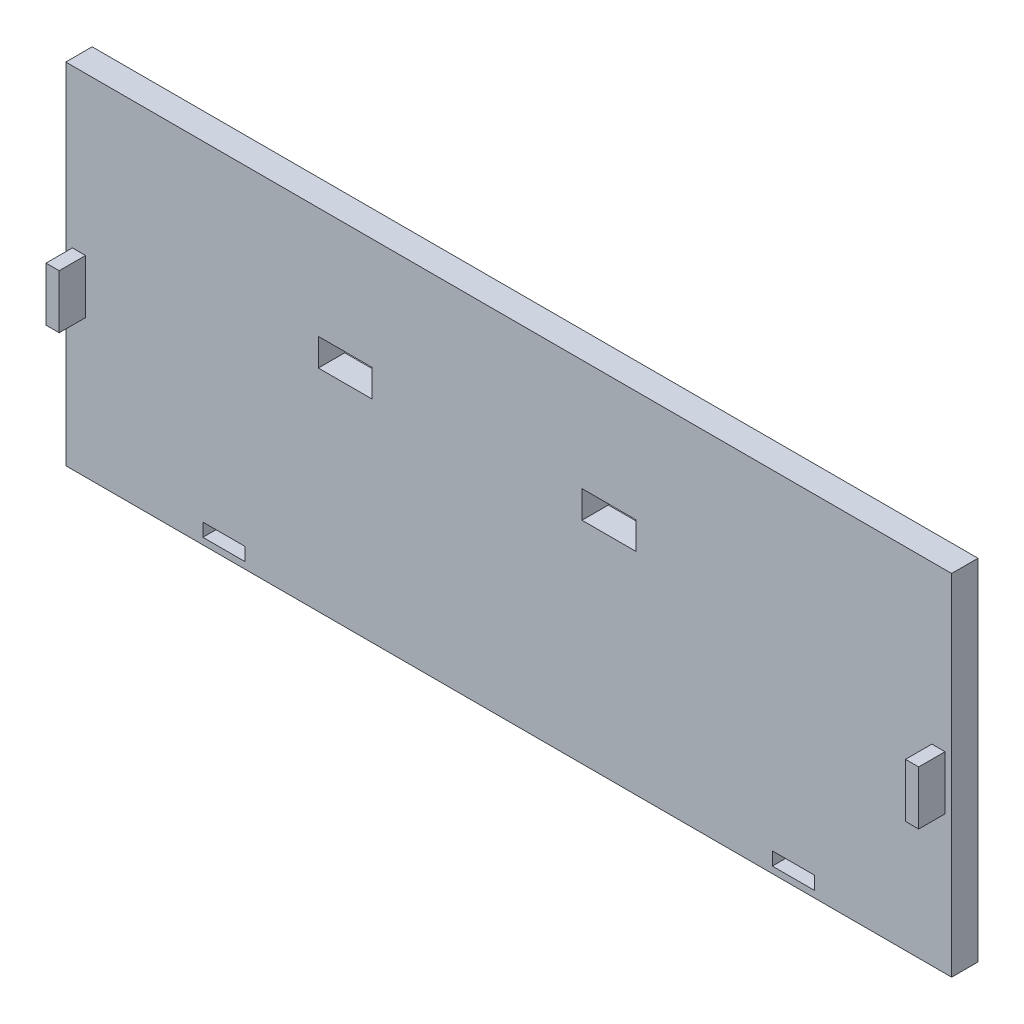
ISO-10303-21;
HEADER;
FILE_DESCRIPTION(('STEP AP214'),'2;1');
FILE_NAME('part.step','',(''),(''),'','','');
FILE_SCHEMA(('AUTOMOTIVE_DESIGN { 1 0 10303 214 1 1 1 1 }'));
ENDSEC;
DATA;
#1=APPLICATION_CONTEXT('core data for automotive mechanical design processes');
#2=APPLICATION_PROTOCOL_DEFINITION('international standard','automotive_design',2000,#1);
#3=PRODUCT_CONTEXT('',#1,'mechanical');
#4=PRODUCT('Part','Part','',(#3));
#5=PRODUCT_RELATED_PRODUCT_CATEGORY('part','',(#4));
#6=PRODUCT_DEFINITION_FORMATION('','',#4);
#7=PRODUCT_DEFINITION_CONTEXT('part definition',#1,'design');
#8=PRODUCT_DEFINITION('design','',#6,#7);
#9=PRODUCT_DEFINITION_SHAPE('','',#8);
#10=(LENGTH_UNIT() NAMED_UNIT(*) SI_UNIT(.MILLI.,.METRE.));
#11=(NAMED_UNIT(*) PLANE_ANGLE_UNIT() SI_UNIT($,.RADIAN.));
#12=(NAMED_UNIT(*) SI_UNIT($,.STERADIAN.) SOLID_ANGLE_UNIT());
#13=UNCERTAINTY_MEASURE_WITH_UNIT(LENGTH_MEASURE(1.E-05),#10,'distance_accuracy_value','');
#14=(GEOMETRIC_REPRESENTATION_CONTEXT(3) GLOBAL_UNCERTAINTY_ASSIGNED_CONTEXT((#13)) GLOBAL_UNIT_ASSIGNED_CONTEXT((#10,
#11,#12)) REPRESENTATION_CONTEXT('',''));
#15=CARTESIAN_POINT('',(0.,0.,0.));
#16=DIRECTION('',(0.,0.,1.));
#17=DIRECTION('',(1.,0.,0.));
#18=AXIS2_PLACEMENT_3D('',#15,#16,#17);
#19=CARTESIAN_POINT('',(0.,0.,0.));
#20=DIRECTION('',(0.,0.,-1.));
#21=DIRECTION('',(-1.,0.,0.));
#22=AXIS2_PLACEMENT_3D('',#19,#20,#21);
#23=PLANE('',#22);
#24=DIRECTION('',(0.,1.,0.));
#25=VECTOR('',#24,1.);
#26=CARTESIAN_POINT('',(97.9,0.,0.));
#27=LINE('',#26,#25);
#28=CARTESIAN_POINT('',(97.9,40.,0.));
#29=VERTEX_POINT('',#28);
#30=CARTESIAN_POINT('',(97.9,45.2,0.));
#31=VERTEX_POINT('',#30);
#32=EDGE_CURVE('E360',#29,#31,#27,.T.);
#33=ORIENTED_EDGE('',*,*,#32,.T.);
#34=DIRECTION('',(-1.,0.,0.));
#35=VECTOR('',#34,1.);
#36=CARTESIAN_POINT('',(0.,45.2,0.));
#37=LINE('',#36,#35);
#38=CARTESIAN_POINT('',(108.1,45.2,0.));
#39=VERTEX_POINT('',#38);
#40=EDGE_CURVE('E348',#39,#31,#37,.T.);
#41=ORIENTED_EDGE('',*,*,#40,.F.);
#42=DIRECTION('',(0.,1.,0.));
#43=VECTOR('',#42,1.);
#44=CARTESIAN_POINT('',(108.1,0.,0.));
#45=LINE('',#44,#43);
#46=CARTESIAN_POINT('',(108.1,40.,0.));
#47=VERTEX_POINT('',#46);
#48=EDGE_CURVE('E369',#47,#39,#45,.T.);
#49=ORIENTED_EDGE('',*,*,#48,.F.);
#50=DIRECTION('',(-1.,0.,0.));
#51=VECTOR('',#50,1.);
#52=CARTESIAN_POINT('',(0.,40.,0.));
#53=LINE('',#52,#51);
#54=EDGE_CURVE('E364',#47,#29,#53,.T.);
#55=ORIENTED_EDGE('',*,*,#54,.T.);
#56=EDGE_LOOP('',(#33,#41,#49,#55));
#57=FACE_BOUND('',#56,.T.);
#58=DIRECTION('',(0.,1.,0.));
#59=VECTOR('',#58,1.);
#60=CARTESIAN_POINT('',(47.9,40.,0.));
#61=LINE('',#60,#59);
#62=CARTESIAN_POINT('',(47.9,40.,0.));
#63=VERTEX_POINT('',#62);
#64=CARTESIAN_POINT('',(47.9,45.2,0.));
#65=VERTEX_POINT('',#64);
#66=EDGE_CURVE('E411',#63,#65,#61,.T.);
#67=ORIENTED_EDGE('',*,*,#66,.T.);
#68=DIRECTION('',(-1.,0.,0.));
#69=VECTOR('',#68,1.);
#70=CARTESIAN_POINT('',(58.1,45.2,0.));
#71=LINE('',#70,#69);
#72=CARTESIAN_POINT('',(58.1,45.2,0.));
#73=VERTEX_POINT('',#72);
#74=EDGE_CURVE('E365',#73,#65,#71,.T.);
#75=ORIENTED_EDGE('',*,*,#74,.F.);
#76=DIRECTION('',(0.,1.,0.));
#77=VECTOR('',#76,1.);
#78=CARTESIAN_POINT('',(58.1,40.,0.));
#79=LINE('',#78,#77);
#80=CARTESIAN_POINT('',(58.1,40.,0.));
#81=VERTEX_POINT('',#80);
#82=EDGE_CURVE('E402',#81,#73,#79,.T.);
#83=ORIENTED_EDGE('',*,*,#82,.F.);
#84=DIRECTION('',(-1.,0.,0.));
#85=VECTOR('',#84,1.);
#86=CARTESIAN_POINT('',(58.1,40.,0.));
#87=LINE('',#86,#85);
#88=EDGE_CURVE('E406',#81,#63,#87,.T.);
#89=ORIENTED_EDGE('',*,*,#88,.T.);
#90=EDGE_LOOP('',(#67,#75,#83,#89));
#91=FACE_BOUND('',#90,.T.);
#92=DIRECTION('',(1.,0.,0.));
#93=VECTOR('',#92,1.);
#94=CARTESIAN_POINT('',(168.,0.,0.));
#95=LINE('',#94,#93);
#96=CARTESIAN_POINT('',(0.,0.,0.));
#97=VERTEX_POINT('',#96);
#98=CARTESIAN_POINT('',(168.,0.,0.));
#99=VERTEX_POINT('',#98);
#100=EDGE_CURVE('E474',#97,#99,#95,.T.);
#101=ORIENTED_EDGE('',*,*,#100,.T.);
#102=DIRECTION('',(0.,1.,0.));
#103=VECTOR('',#102,1.);
#104=CARTESIAN_POINT('',(168.,66.31,0.));
#105=LINE('',#104,#103);
#106=CARTESIAN_POINT('',(168.,66.31,0.));
#107=VERTEX_POINT('',#106);
#108=EDGE_CURVE('E495',#99,#107,#105,.T.);
#109=ORIENTED_EDGE('',*,*,#108,.T.);
#110=DIRECTION('',(-1.,0.,0.));
#111=VECTOR('',#110,1.);
#112=CARTESIAN_POINT('',(0.,66.31,0.));
#113=LINE('',#112,#111);
#114=CARTESIAN_POINT('',(0.,66.31,0.));
#115=VERTEX_POINT('',#114);
#116=EDGE_CURVE('E499',#107,#115,#113,.T.);
#117=ORIENTED_EDGE('',*,*,#116,.T.);
#118=DIRECTION('',(0.,-1.,0.));
#119=VECTOR('',#118,1.);
#120=CARTESIAN_POINT('',(0.,0.,0.));
#121=LINE('',#120,#119);
#122=EDGE_CURVE('E480',#115,#97,#121,.T.);
#123=ORIENTED_EDGE('',*,*,#122,.T.);
#124=EDGE_LOOP('',(#101,#109,#117,#123));
#125=FACE_BOUND('',#124,.T.);
#126=DIRECTION('',(0.,1.,0.));
#127=VECTOR('',#126,1.);
#128=CARTESIAN_POINT('',(3.75000000000001,26.21,0.));
#129=LINE('',#128,#127);
#130=CARTESIAN_POINT('',(3.75000000000001,26.21,0.));
#131=VERTEX_POINT('',#130);
#132=CARTESIAN_POINT('',(3.75000000000001,36.41,0.));
#133=VERTEX_POINT('',#132);
#134=EDGE_CURVE('E379',#131,#133,#129,.T.);
#135=ORIENTED_EDGE('',*,*,#134,.F.);
#136=DIRECTION('',(1.,0.,0.));
#137=VECTOR('',#136,1.);
#138=CARTESIAN_POINT('',(1.25000000000001,26.21,0.));
#139=LINE('',#138,#137);
#140=CARTESIAN_POINT('',(1.25000000000001,26.21,0.));
#141=VERTEX_POINT('',#140);
#142=EDGE_CURVE('E435',#141,#131,#139,.T.);
#143=ORIENTED_EDGE('',*,*,#142,.F.);
#144=DIRECTION('',(0.,-1.,0.));
#145=VECTOR('',#144,1.);
#146=CARTESIAN_POINT('',(1.25000000000001,26.21,0.));
#147=LINE('',#146,#145);
#148=CARTESIAN_POINT('',(1.25000000000001,36.41,0.));
#149=VERTEX_POINT('',#148);
#150=EDGE_CURVE('E452',#149,#141,#147,.T.);
#151=ORIENTED_EDGE('',*,*,#150,.F.);
#152=DIRECTION('',(-1.,0.,0.));
#153=VECTOR('',#152,1.);
#154=CARTESIAN_POINT('',(1.25000000000001,36.41,0.));
#155=LINE('',#154,#153);
#156=EDGE_CURVE('E448',#133,#149,#155,.T.);
#157=ORIENTED_EDGE('',*,*,#156,.F.);
#158=EDGE_LOOP('',(#135,#143,#151,#157));
#159=FACE_BOUND('',#158,.T.);
#160=DIRECTION('',(-1.,0.,0.));
#161=VECTOR('',#160,1.);
#162=CARTESIAN_POINT('',(134.,3.75000000000001,0.));
#163=LINE('',#162,#161);
#164=CARTESIAN_POINT('',(142.,3.75000000000001,0.));
#165=VERTEX_POINT('',#164);
#166=CARTESIAN_POINT('',(134.,3.75000000000001,0.));
#167=VERTEX_POINT('',#166);
#168=EDGE_CURVE('E253',#165,#167,#163,.T.);
#169=ORIENTED_EDGE('',*,*,#168,.F.);
#170=DIRECTION('',(0.,1.,0.));
#171=VECTOR('',#170,1.);
#172=CARTESIAN_POINT('',(142.,1.25000000000001,0.));
#173=LINE('',#172,#171);
#174=CARTESIAN_POINT('',(142.,1.25000000000001,0.));
#175=VERTEX_POINT('',#174);
#176=EDGE_CURVE('E249',#175,#165,#173,.T.);
#177=ORIENTED_EDGE('',*,*,#176,.F.);
#178=DIRECTION('',(1.,0.,0.));
#179=VECTOR('',#178,1.);
#180=CARTESIAN_POINT('',(134.,1.25000000000001,0.));
#181=LINE('',#180,#179);
#182=CARTESIAN_POINT('',(134.,1.25000000000001,0.));
#183=VERTEX_POINT('',#182);
#184=EDGE_CURVE('E310',#183,#175,#181,.T.);
#185=ORIENTED_EDGE('',*,*,#184,.F.);
#186=DIRECTION('',(0.,-1.,0.));
#187=VECTOR('',#186,1.);
#188=CARTESIAN_POINT('',(134.,1.25000000000001,0.));
#189=LINE('',#188,#187);
#190=EDGE_CURVE('E326',#167,#183,#189,.T.);
#191=ORIENTED_EDGE('',*,*,#190,.F.);
#192=EDGE_LOOP('',(#169,#177,#185,#191));
#193=FACE_BOUND('',#192,.T.);
#194=DIRECTION('',(-1.,0.,0.));
#195=VECTOR('',#194,1.);
#196=CARTESIAN_POINT('',(26.,3.75,0.));
#197=LINE('',#196,#195);
#198=CARTESIAN_POINT('',(34.,3.75,0.));
#199=VERTEX_POINT('',#198);
#200=CARTESIAN_POINT('',(26.,3.75,0.));
#201=VERTEX_POINT('',#200);
#202=EDGE_CURVE('E280',#199,#201,#197,.T.);
#203=ORIENTED_EDGE('',*,*,#202,.F.);
#204=DIRECTION('',(0.,1.,0.));
#205=VECTOR('',#204,1.);
#206=CARTESIAN_POINT('',(34.,3.75,0.));
#207=LINE('',#206,#205);
#208=CARTESIAN_POINT('',(34.,1.25,0.));
#209=VERTEX_POINT('',#208);
#210=EDGE_CURVE('E277',#209,#199,#207,.T.);
#211=ORIENTED_EDGE('',*,*,#210,.F.);
#212=DIRECTION('',(1.,0.,0.));
#213=VECTOR('',#212,1.);
#214=CARTESIAN_POINT('',(26.,1.25,0.));
#215=LINE('',#214,#213);
#216=CARTESIAN_POINT('',(26.,1.25,0.));
#217=VERTEX_POINT('',#216);
#218=EDGE_CURVE('E264',#217,#209,#215,.T.);
#219=ORIENTED_EDGE('',*,*,#218,.F.);
#220=DIRECTION('',(0.,-1.,0.));
#221=VECTOR('',#220,1.);
#222=CARTESIAN_POINT('',(26.,3.75,0.));
#223=LINE('',#222,#221);
#224=EDGE_CURVE('E285',#201,#217,#223,.T.);
#225=ORIENTED_EDGE('',*,*,#224,.F.);
#226=EDGE_LOOP('',(#203,#211,#219,#225));
#227=FACE_BOUND('',#226,.T.);
#228=DIRECTION('',(0.,1.,0.));
#229=VECTOR('',#228,1.);
#230=CARTESIAN_POINT('',(166.75,36.41,0.));
#231=LINE('',#230,#229);
#232=CARTESIAN_POINT('',(166.75,26.21,0.));
#233=VERTEX_POINT('',#232);
#234=CARTESIAN_POINT('',(166.75,36.41,0.));
#235=VERTEX_POINT('',#234);
#236=EDGE_CURVE('E247',#233,#235,#231,.T.);
#237=ORIENTED_EDGE('',*,*,#236,.F.);
#238=DIRECTION('',(1.,0.,0.));
#239=VECTOR('',#238,1.);
#240=CARTESIAN_POINT('',(164.25,26.21,0.));
#241=LINE('',#240,#239);
#242=CARTESIAN_POINT('',(164.25,26.21,0.));
#243=VERTEX_POINT('',#242);
#244=EDGE_CURVE('E244',#243,#233,#241,.T.);
#245=ORIENTED_EDGE('',*,*,#244,.F.);
#246=DIRECTION('',(0.,-1.,0.));
#247=VECTOR('',#246,1.);
#248=CARTESIAN_POINT('',(164.25,36.41,0.));
#249=LINE('',#248,#247);
#250=CARTESIAN_POINT('',(164.25,36.41,0.));
#251=VERTEX_POINT('',#250);
#252=EDGE_CURVE('E61',#251,#243,#249,.T.);
#253=ORIENTED_EDGE('',*,*,#252,.F.);
#254=DIRECTION('',(-1.,0.,0.));
#255=VECTOR('',#254,1.);
#256=CARTESIAN_POINT('',(164.25,36.41,0.));
#257=LINE('',#256,#255);
#258=EDGE_CURVE('E56',#235,#251,#257,.T.);
#259=ORIENTED_EDGE('',*,*,#258,.F.);
#260=EDGE_LOOP('',(#237,#245,#253,#259));
#261=FACE_BOUND('',#260,.T.);
#262=ADVANCED_FACE('F38',(#57,#91,#125,#159,#193,#227,#261),#23,.F.);
#263=CARTESIAN_POINT('',(0.,0.,-5.));
#264=DIRECTION('',(0.,0.,-1.));
#265=DIRECTION('',(-1.,0.,0.));
#266=AXIS2_PLACEMENT_3D('',#263,#264,#265);
#267=PLANE('',#266);
#268=DIRECTION('',(0.,1.,0.));
#269=VECTOR('',#268,1.);
#270=CARTESIAN_POINT('',(34.,3.75,-5.));
#271=LINE('',#270,#269);
#272=CARTESIAN_POINT('',(34.,1.25,-5.));
#273=VERTEX_POINT('',#272);
#274=CARTESIAN_POINT('',(34.,3.75,-5.));
#275=VERTEX_POINT('',#274);
#276=EDGE_CURVE('E259',#273,#275,#271,.T.);
#277=ORIENTED_EDGE('',*,*,#276,.T.);
#278=DIRECTION('',(-1.,0.,0.));
#279=VECTOR('',#278,1.);
#280=CARTESIAN_POINT('',(26.,3.75,-5.));
#281=LINE('',#280,#279);
#282=CARTESIAN_POINT('',(26.,3.75,-5.));
#283=VERTEX_POINT('',#282);
#284=EDGE_CURVE('E263',#275,#283,#281,.T.);
#285=ORIENTED_EDGE('',*,*,#284,.T.);
#286=DIRECTION('',(0.,-1.,0.));
#287=VECTOR('',#286,1.);
#288=CARTESIAN_POINT('',(26.,3.75,-5.));
#289=LINE('',#288,#287);
#290=CARTESIAN_POINT('',(26.,1.25,-5.));
#291=VERTEX_POINT('',#290);
#292=EDGE_CURVE('E268',#283,#291,#289,.T.);
#293=ORIENTED_EDGE('',*,*,#292,.T.);
#294=DIRECTION('',(1.,0.,0.));
#295=VECTOR('',#294,1.);
#296=CARTESIAN_POINT('',(26.,1.25,-5.));
#297=LINE('',#296,#295);
#298=EDGE_CURVE('E272',#291,#273,#297,.T.);
#299=ORIENTED_EDGE('',*,*,#298,.T.);
#300=EDGE_LOOP('',(#277,#285,#293,#299));
#301=FACE_BOUND('',#300,.T.);
#302=DIRECTION('',(0.,1.,0.));
#303=VECTOR('',#302,1.);
#304=CARTESIAN_POINT('',(142.,1.25000000000001,-5.));
#305=LINE('',#304,#303);
#306=CARTESIAN_POINT('',(142.,1.25000000000001,-5.));
#307=VERTEX_POINT('',#306);
#308=CARTESIAN_POINT('',(142.,3.75000000000001,-5.));
#309=VERTEX_POINT('',#308);
#310=EDGE_CURVE('E305',#307,#309,#305,.T.);
#311=ORIENTED_EDGE('',*,*,#310,.T.);
#312=DIRECTION('',(-1.,0.,0.));
#313=VECTOR('',#312,1.);
#314=CARTESIAN_POINT('',(134.,3.75000000000001,-5.));
#315=LINE('',#314,#313);
#316=CARTESIAN_POINT('',(134.,3.75000000000001,-5.));
#317=VERTEX_POINT('',#316);
#318=EDGE_CURVE('E309',#309,#317,#315,.T.);
#319=ORIENTED_EDGE('',*,*,#318,.T.);
#320=DIRECTION('',(0.,-1.,0.));
#321=VECTOR('',#320,1.);
#322=CARTESIAN_POINT('',(134.,1.25000000000001,-5.));
#323=LINE('',#322,#321);
#324=CARTESIAN_POINT('',(134.,1.25000000000001,-5.));
#325=VERTEX_POINT('',#324);
#326=EDGE_CURVE('E314',#317,#325,#323,.T.);
#327=ORIENTED_EDGE('',*,*,#326,.T.);
#328=DIRECTION('',(1.,0.,0.));
#329=VECTOR('',#328,1.);
#330=CARTESIAN_POINT('',(134.,1.25000000000001,-5.));
#331=LINE('',#330,#329);
#332=EDGE_CURVE('E318',#325,#307,#331,.T.);
#333=ORIENTED_EDGE('',*,*,#332,.T.);
#334=EDGE_LOOP('',(#311,#319,#327,#333));
#335=FACE_BOUND('',#334,.T.);
#336=DIRECTION('',(-1.,0.,0.));
#337=VECTOR('',#336,1.);
#338=CARTESIAN_POINT('',(58.1,45.2,-5.));
#339=LINE('',#338,#337);
#340=CARTESIAN_POINT('',(58.1,45.2,-5.));
#341=VERTEX_POINT('',#340);
#342=CARTESIAN_POINT('',(47.9,45.2,-5.));
#343=VERTEX_POINT('',#342);
#344=EDGE_CURVE('E407',#341,#343,#339,.T.);
#345=ORIENTED_EDGE('',*,*,#344,.T.);
#346=DIRECTION('',(0.,1.,0.));
#347=VECTOR('',#346,1.);
#348=CARTESIAN_POINT('',(47.9,40.,-5.));
#349=LINE('',#348,#347);
#350=CARTESIAN_POINT('',(47.9,40.,-5.));
#351=VERTEX_POINT('',#350);
#352=EDGE_CURVE('E424',#351,#343,#349,.T.);
#353=ORIENTED_EDGE('',*,*,#352,.F.);
#354=DIRECTION('',(-1.,0.,0.));
#355=VECTOR('',#354,1.);
#356=CARTESIAN_POINT('',(58.1,40.,-5.));
#357=LINE('',#356,#355);
#358=CARTESIAN_POINT('',(58.1,40.,-5.));
#359=VERTEX_POINT('',#358);
#360=EDGE_CURVE('E420',#359,#351,#357,.T.);
#361=ORIENTED_EDGE('',*,*,#360,.F.);
#362=DIRECTION('',(0.,1.,0.));
#363=VECTOR('',#362,1.);
#364=CARTESIAN_POINT('',(58.1,40.,-5.));
#365=LINE('',#364,#363);
#366=EDGE_CURVE('E393',#359,#341,#365,.T.);
#367=ORIENTED_EDGE('',*,*,#366,.T.);
#368=EDGE_LOOP('',(#345,#353,#361,#367));
#369=FACE_BOUND('',#368,.T.);
#370=DIRECTION('',(1.,0.,0.));
#371=VECTOR('',#370,1.);
#372=CARTESIAN_POINT('',(168.,0.,-5.));
#373=LINE('',#372,#371);
#374=CARTESIAN_POINT('',(0.,0.,-5.));
#375=VERTEX_POINT('',#374);
#376=CARTESIAN_POINT('',(168.,0.,-5.));
#377=VERTEX_POINT('',#376);
#378=EDGE_CURVE('E475',#375,#377,#373,.T.);
#379=ORIENTED_EDGE('',*,*,#378,.F.);
#380=DIRECTION('',(0.,-1.,0.));
#381=VECTOR('',#380,1.);
#382=CARTESIAN_POINT('',(0.,0.,-5.));
#383=LINE('',#382,#381);
#384=CARTESIAN_POINT('',(0.,66.31,-5.));
#385=VERTEX_POINT('',#384);
#386=EDGE_CURVE('E488',#385,#375,#383,.T.);
#387=ORIENTED_EDGE('',*,*,#386,.F.);
#388=DIRECTION('',(-1.,0.,0.));
#389=VECTOR('',#388,1.);
#390=CARTESIAN_POINT('',(0.,66.31,-5.));
#391=LINE('',#390,#389);
#392=CARTESIAN_POINT('',(168.,66.31,-5.));
#393=VERTEX_POINT('',#392);
#394=EDGE_CURVE('E484',#393,#385,#391,.T.);
#395=ORIENTED_EDGE('',*,*,#394,.F.);
#396=DIRECTION('',(0.,1.,0.));
#397=VECTOR('',#396,1.);
#398=CARTESIAN_POINT('',(168.,66.31,-5.));
#399=LINE('',#398,#397);
#400=EDGE_CURVE('E479',#377,#393,#399,.T.);
#401=ORIENTED_EDGE('',*,*,#400,.F.);
#402=EDGE_LOOP('',(#379,#387,#395,#401));
#403=FACE_BOUND('',#402,.T.);
#404=DIRECTION('',(-1.,0.,0.));
#405=VECTOR('',#404,1.);
#406=CARTESIAN_POINT('',(0.,45.2,-5.));
#407=LINE('',#406,#405);
#408=CARTESIAN_POINT('',(108.1,45.2,-5.));
#409=VERTEX_POINT('',#408);
#410=CARTESIAN_POINT('',(97.9,45.2,-5.));
#411=VERTEX_POINT('',#410);
#412=EDGE_CURVE('E355',#409,#411,#407,.T.);
#413=ORIENTED_EDGE('',*,*,#412,.T.);
#414=DIRECTION('',(0.,1.,0.));
#415=VECTOR('',#414,1.);
#416=CARTESIAN_POINT('',(97.9,0.,-5.));
#417=LINE('',#416,#415);
#418=CARTESIAN_POINT('',(97.9,40.,-5.));
#419=VERTEX_POINT('',#418);
#420=EDGE_CURVE('E344',#419,#411,#417,.T.);
#421=ORIENTED_EDGE('',*,*,#420,.F.);
#422=DIRECTION('',(-1.,0.,0.));
#423=VECTOR('',#422,1.);
#424=CARTESIAN_POINT('',(0.,40.,-5.));
#425=LINE('',#424,#423);
#426=CARTESIAN_POINT('',(108.1,40.,-5.));
#427=VERTEX_POINT('',#426);
#428=EDGE_CURVE('E347',#427,#419,#425,.T.);
#429=ORIENTED_EDGE('',*,*,#428,.F.);
#430=DIRECTION('',(0.,1.,0.));
#431=VECTOR('',#430,1.);
#432=CARTESIAN_POINT('',(108.1,0.,-5.));
#433=LINE('',#432,#431);
#434=EDGE_CURVE('E351',#427,#409,#433,.T.);
#435=ORIENTED_EDGE('',*,*,#434,.T.);
#436=EDGE_LOOP('',(#413,#421,#429,#435));
#437=FACE_BOUND('',#436,.T.);
#438=ADVANCED_FACE('F525',(#301,#335,#369,#403,#437),#267,.T.);
#439=CARTESIAN_POINT('',(168.,0.,-5.));
#440=DIRECTION('',(0.,-1.,0.));
#441=DIRECTION('',(1.,0.,0.));
#442=AXIS2_PLACEMENT_3D('',#439,#440,#441);
#443=PLANE('',#442);
#444=ORIENTED_EDGE('',*,*,#100,.F.);
#445=DIRECTION('',(0.,0.,1.));
#446=VECTOR('',#445,1.);
#447=CARTESIAN_POINT('',(0.,0.,-5.));
#448=LINE('',#447,#446);
#449=EDGE_CURVE('E11',#375,#97,#448,.T.);
#450=ORIENTED_EDGE('',*,*,#449,.F.);
#451=ORIENTED_EDGE('',*,*,#378,.T.);
#452=DIRECTION('',(0.,0.,1.));
#453=VECTOR('',#452,1.);
#454=CARTESIAN_POINT('',(168.,0.,-5.));
#455=LINE('',#454,#453);
#456=EDGE_CURVE('E42',#377,#99,#455,.T.);
#457=ORIENTED_EDGE('',*,*,#456,.T.);
#458=EDGE_LOOP('',(#444,#450,#451,#457));
#459=FACE_BOUND('',#458,.T.);
#460=ADVANCED_FACE('F40',(#459),#443,.T.);
#461=CARTESIAN_POINT('',(0.,0.,-5.));
#462=DIRECTION('',(-1.,0.,0.));
#463=DIRECTION('',(0.,0.,1.));
#464=AXIS2_PLACEMENT_3D('',#461,#462,#463);
#465=PLANE('',#464);
#466=ORIENTED_EDGE('',*,*,#122,.F.);
#467=DIRECTION('',(0.,0.,1.));
#468=VECTOR('',#467,1.);
#469=CARTESIAN_POINT('',(0.,66.31,-5.));
#470=LINE('',#469,#468);
#471=EDGE_CURVE('E48',#385,#115,#470,.T.);
#472=ORIENTED_EDGE('',*,*,#471,.F.);
#473=ORIENTED_EDGE('',*,*,#386,.T.);
#474=ORIENTED_EDGE('',*,*,#449,.T.);
#475=EDGE_LOOP('',(#466,#472,#473,#474));
#476=FACE_BOUND('',#475,.T.);
#477=ADVANCED_FACE('F522',(#476),#465,.T.);
#478=CARTESIAN_POINT('',(0.,66.31,-5.));
#479=DIRECTION('',(0.,1.,0.));
#480=DIRECTION('',(0.,0.,1.));
#481=AXIS2_PLACEMENT_3D('',#478,#479,#480);
#482=PLANE('',#481);
#483=ORIENTED_EDGE('',*,*,#116,.F.);
#484=DIRECTION('',(0.,0.,1.));
#485=VECTOR('',#484,1.);
#486=CARTESIAN_POINT('',(168.,66.31,-5.));
#487=LINE('',#486,#485);
#488=EDGE_CURVE('E507',#393,#107,#487,.T.);
#489=ORIENTED_EDGE('',*,*,#488,.F.);
#490=ORIENTED_EDGE('',*,*,#394,.T.);
#491=ORIENTED_EDGE('',*,*,#471,.T.);
#492=EDGE_LOOP('',(#483,#489,#490,#491));
#493=FACE_BOUND('',#492,.T.);
#494=ADVANCED_FACE('F529',(#493),#482,.T.);
#495=CARTESIAN_POINT('',(168.,66.31,-5.));
#496=DIRECTION('',(1.,0.,0.));
#497=DIRECTION('',(0.,0.,-1.));
#498=AXIS2_PLACEMENT_3D('',#495,#496,#497);
#499=PLANE('',#498);
#500=ORIENTED_EDGE('',*,*,#108,.F.);
#501=ORIENTED_EDGE('',*,*,#456,.F.);
#502=ORIENTED_EDGE('',*,*,#400,.T.);
#503=ORIENTED_EDGE('',*,*,#488,.T.);
#504=EDGE_LOOP('',(#500,#501,#502,#503));
#505=FACE_BOUND('',#504,.T.);
#506=ADVANCED_FACE('F517',(#505),#499,.T.);
#507=CARTESIAN_POINT('',(3.75000000000001,26.21,5.));
#508=DIRECTION('',(-1.,0.,0.));
#509=DIRECTION('',(0.,0.,1.));
#510=AXIS2_PLACEMENT_3D('',#507,#508,#509);
#511=PLANE('',#510);
#512=ORIENTED_EDGE('',*,*,#134,.T.);
#513=DIRECTION('',(0.,0.,-1.));
#514=VECTOR('',#513,1.);
#515=CARTESIAN_POINT('',(3.75000000000001,36.41,5.));
#516=LINE('',#515,#514);
#517=CARTESIAN_POINT('',(3.75000000000001,36.41,5.));
#518=VERTEX_POINT('',#517);
#519=EDGE_CURVE('E470',#518,#133,#516,.T.);
#520=ORIENTED_EDGE('',*,*,#519,.F.);
#521=DIRECTION('',(0.,1.,0.));
#522=VECTOR('',#521,1.);
#523=CARTESIAN_POINT('',(3.75000000000001,26.21,5.));
#524=LINE('',#523,#522);
#525=CARTESIAN_POINT('',(3.75000000000001,26.21,5.));
#526=VERTEX_POINT('',#525);
#527=EDGE_CURVE('E430',#526,#518,#524,.T.);
#528=ORIENTED_EDGE('',*,*,#527,.F.);
#529=DIRECTION('',(0.,0.,-1.));
#530=VECTOR('',#529,1.);
#531=CARTESIAN_POINT('',(3.75000000000001,26.21,5.));
#532=LINE('',#531,#530);
#533=EDGE_CURVE('E444',#526,#131,#532,.T.);
#534=ORIENTED_EDGE('',*,*,#533,.T.);
#535=EDGE_LOOP('',(#512,#520,#528,#534));
#536=FACE_BOUND('',#535,.T.);
#537=ADVANCED_FACE('F536',(#536),#511,.F.);
#538=CARTESIAN_POINT('',(1.25000000000001,36.41,5.));
#539=DIRECTION('',(0.,-1.,0.));
#540=DIRECTION('',(0.,0.,-1.));
#541=AXIS2_PLACEMENT_3D('',#538,#539,#540);
#542=PLANE('',#541);
#543=ORIENTED_EDGE('',*,*,#156,.T.);
#544=DIRECTION('',(0.,0.,-1.));
#545=VECTOR('',#544,1.);
#546=CARTESIAN_POINT('',(1.25000000000001,36.41,5.));
#547=LINE('',#546,#545);
#548=CARTESIAN_POINT('',(1.25000000000001,36.41,5.));
#549=VERTEX_POINT('',#548);
#550=EDGE_CURVE('E466',#549,#149,#547,.T.);
#551=ORIENTED_EDGE('',*,*,#550,.F.);
#552=DIRECTION('',(-1.,0.,0.));
#553=VECTOR('',#552,1.);
#554=CARTESIAN_POINT('',(1.25000000000001,36.41,5.));
#555=LINE('',#554,#553);
#556=EDGE_CURVE('E434',#518,#549,#555,.T.);
#557=ORIENTED_EDGE('',*,*,#556,.F.);
#558=ORIENTED_EDGE('',*,*,#519,.T.);
#559=EDGE_LOOP('',(#543,#551,#557,#558));
#560=FACE_BOUND('',#559,.T.);
#561=ADVANCED_FACE('F550',(#560),#542,.F.);
#562=CARTESIAN_POINT('',(1.25000000000001,26.21,5.));
#563=DIRECTION('',(1.,0.,0.));
#564=DIRECTION('',(0.,0.,-1.));
#565=AXIS2_PLACEMENT_3D('',#562,#563,#564);
#566=PLANE('',#565);
#567=ORIENTED_EDGE('',*,*,#150,.T.);
#568=DIRECTION('',(0.,0.,-1.));
#569=VECTOR('',#568,1.);
#570=CARTESIAN_POINT('',(1.25000000000001,26.21,5.));
#571=LINE('',#570,#569);
#572=CARTESIAN_POINT('',(1.25000000000001,26.21,5.));
#573=VERTEX_POINT('',#572);
#574=EDGE_CURVE('E462',#573,#141,#571,.T.);
#575=ORIENTED_EDGE('',*,*,#574,.F.);
#576=DIRECTION('',(0.,-1.,0.));
#577=VECTOR('',#576,1.);
#578=CARTESIAN_POINT('',(1.25000000000001,26.21,5.));
#579=LINE('',#578,#577);
#580=EDGE_CURVE('E438',#549,#573,#579,.T.);
#581=ORIENTED_EDGE('',*,*,#580,.F.);
#582=ORIENTED_EDGE('',*,*,#550,.T.);
#583=EDGE_LOOP('',(#567,#575,#581,#582));
#584=FACE_BOUND('',#583,.T.);
#585=ADVANCED_FACE('F554',(#584),#566,.F.);
#586=CARTESIAN_POINT('',(1.25000000000001,26.21,5.));
#587=DIRECTION('',(0.,1.,0.));
#588=DIRECTION('',(0.,0.,1.));
#589=AXIS2_PLACEMENT_3D('',#586,#587,#588);
#590=PLANE('',#589);
#591=ORIENTED_EDGE('',*,*,#142,.T.);
#592=ORIENTED_EDGE('',*,*,#533,.F.);
#593=DIRECTION('',(1.,0.,0.));
#594=VECTOR('',#593,1.);
#595=CARTESIAN_POINT('',(1.25000000000001,26.21,5.));
#596=LINE('',#595,#594);
#597=EDGE_CURVE('E441',#573,#526,#596,.T.);
#598=ORIENTED_EDGE('',*,*,#597,.F.);
#599=ORIENTED_EDGE('',*,*,#574,.T.);
#600=EDGE_LOOP('',(#591,#592,#598,#599));
#601=FACE_BOUND('',#600,.T.);
#602=ADVANCED_FACE('F558',(#601),#590,.F.);
#603=CARTESIAN_POINT('',(0.,0.,5.));
#604=DIRECTION('',(0.,0.,-1.));
#605=DIRECTION('',(-1.,0.,0.));
#606=AXIS2_PLACEMENT_3D('',#603,#604,#605);
#607=PLANE('',#606);
#608=ORIENTED_EDGE('',*,*,#527,.T.);
#609=ORIENTED_EDGE('',*,*,#556,.T.);
#610=ORIENTED_EDGE('',*,*,#580,.T.);
#611=ORIENTED_EDGE('',*,*,#597,.T.);
#612=EDGE_LOOP('',(#608,#609,#610,#611));
#613=FACE_BOUND('',#612,.T.);
#614=ADVANCED_FACE('F562',(#613),#607,.F.);
#615=CARTESIAN_POINT('',(58.1,45.2,-5.));
#616=DIRECTION('',(0.,1.,0.));
#617=DIRECTION('',(0.,0.,1.));
#618=AXIS2_PLACEMENT_3D('',#615,#616,#617);
#619=PLANE('',#618);
#620=ORIENTED_EDGE('',*,*,#74,.T.);
#621=DIRECTION('',(0.,0.,1.));
#622=VECTOR('',#621,1.);
#623=CARTESIAN_POINT('',(47.9,45.2,-5.));
#624=LINE('',#623,#622);
#625=EDGE_CURVE('E389',#343,#65,#624,.T.);
#626=ORIENTED_EDGE('',*,*,#625,.F.);
#627=ORIENTED_EDGE('',*,*,#344,.F.);
#628=DIRECTION('',(0.,0.,1.));
#629=VECTOR('',#628,1.);
#630=CARTESIAN_POINT('',(58.1,45.2,-5.));
#631=LINE('',#630,#629);
#632=EDGE_CURVE('E295',#341,#73,#631,.T.);
#633=ORIENTED_EDGE('',*,*,#632,.T.);
#634=EDGE_LOOP('',(#620,#626,#627,#633));
#635=FACE_BOUND('',#634,.T.);
#636=ADVANCED_FACE('F566',(#635),#619,.F.);
#637=CARTESIAN_POINT('',(58.1,40.,-5.));
#638=DIRECTION('',(1.,0.,0.));
#639=DIRECTION('',(0.,0.,-1.));
#640=AXIS2_PLACEMENT_3D('',#637,#638,#639);
#641=PLANE('',#640);
#642=ORIENTED_EDGE('',*,*,#82,.T.);
#643=ORIENTED_EDGE('',*,*,#632,.F.);
#644=ORIENTED_EDGE('',*,*,#366,.F.);
#645=DIRECTION('',(0.,0.,1.));
#646=VECTOR('',#645,1.);
#647=CARTESIAN_POINT('',(58.1,40.,-5.));
#648=LINE('',#647,#646);
#649=EDGE_CURVE('E397',#359,#81,#648,.T.);
#650=ORIENTED_EDGE('',*,*,#649,.T.);
#651=EDGE_LOOP('',(#642,#643,#644,#650));
#652=FACE_BOUND('',#651,.T.);
#653=ADVANCED_FACE('F568',(#652),#641,.F.);
#654=CARTESIAN_POINT('',(58.1,40.,-5.));
#655=DIRECTION('',(0.,1.,0.));
#656=DIRECTION('',(0.,0.,1.));
#657=AXIS2_PLACEMENT_3D('',#654,#655,#656);
#658=PLANE('',#657);
#659=ORIENTED_EDGE('',*,*,#88,.F.);
#660=ORIENTED_EDGE('',*,*,#649,.F.);
#661=ORIENTED_EDGE('',*,*,#360,.T.);
#662=DIRECTION('',(0.,0.,1.));
#663=VECTOR('',#662,1.);
#664=CARTESIAN_POINT('',(47.9,40.,-5.));
#665=LINE('',#664,#663);
#666=EDGE_CURVE('E394',#351,#63,#665,.T.);
#667=ORIENTED_EDGE('',*,*,#666,.T.);
#668=EDGE_LOOP('',(#659,#660,#661,#667));
#669=FACE_BOUND('',#668,.T.);
#670=ADVANCED_FACE('F571',(#669),#658,.T.);
#671=CARTESIAN_POINT('',(47.9,40.,-5.));
#672=DIRECTION('',(1.,0.,0.));
#673=DIRECTION('',(0.,0.,-1.));
#674=AXIS2_PLACEMENT_3D('',#671,#672,#673);
#675=PLANE('',#674);
#676=ORIENTED_EDGE('',*,*,#66,.F.);
#677=ORIENTED_EDGE('',*,*,#666,.F.);
#678=ORIENTED_EDGE('',*,*,#352,.T.);
#679=ORIENTED_EDGE('',*,*,#625,.T.);
#680=EDGE_LOOP('',(#676,#677,#678,#679));
#681=FACE_BOUND('',#680,.T.);
#682=ADVANCED_FACE('F575',(#681),#675,.T.);
#683=CARTESIAN_POINT('',(97.9,0.,-5.));
#684=DIRECTION('',(1.,0.,0.));
#685=DIRECTION('',(0.,0.,-1.));
#686=AXIS2_PLACEMENT_3D('',#683,#684,#685);
#687=PLANE('',#686);
#688=ORIENTED_EDGE('',*,*,#32,.F.);
#689=DIRECTION('',(0.,0.,1.));
#690=VECTOR('',#689,1.);
#691=CARTESIAN_POINT('',(97.9,40.,-5.));
#692=LINE('',#691,#690);
#693=EDGE_CURVE('E359',#419,#29,#692,.T.);
#694=ORIENTED_EDGE('',*,*,#693,.F.);
#695=ORIENTED_EDGE('',*,*,#420,.T.);
#696=DIRECTION('',(0.,0.,1.));
#697=VECTOR('',#696,1.);
#698=CARTESIAN_POINT('',(97.9,45.2,-5.));
#699=LINE('',#698,#697);
#700=EDGE_CURVE('E376',#411,#31,#699,.T.);
#701=ORIENTED_EDGE('',*,*,#700,.T.);
#702=EDGE_LOOP('',(#688,#694,#695,#701));
#703=FACE_BOUND('',#702,.T.);
#704=ADVANCED_FACE('F579',(#703),#687,.T.);
#705=CARTESIAN_POINT('',(0.,45.2,-5.));
#706=DIRECTION('',(0.,1.,0.));
#707=DIRECTION('',(0.,0.,1.));
#708=AXIS2_PLACEMENT_3D('',#705,#706,#707);
#709=PLANE('',#708);
#710=ORIENTED_EDGE('',*,*,#40,.T.);
#711=ORIENTED_EDGE('',*,*,#700,.F.);
#712=ORIENTED_EDGE('',*,*,#412,.F.);
#713=DIRECTION('',(0.,0.,1.));
#714=VECTOR('',#713,1.);
#715=CARTESIAN_POINT('',(108.1,45.2,-5.));
#716=LINE('',#715,#714);
#717=EDGE_CURVE('E380',#409,#39,#716,.T.);
#718=ORIENTED_EDGE('',*,*,#717,.T.);
#719=EDGE_LOOP('',(#710,#711,#712,#718));
#720=FACE_BOUND('',#719,.T.);
#721=ADVANCED_FACE('F586',(#720),#709,.F.);
#722=CARTESIAN_POINT('',(108.1,0.,-5.));
#723=DIRECTION('',(1.,0.,0.));
#724=DIRECTION('',(0.,0.,-1.));
#725=AXIS2_PLACEMENT_3D('',#722,#723,#724);
#726=PLANE('',#725);
#727=ORIENTED_EDGE('',*,*,#48,.T.);
#728=ORIENTED_EDGE('',*,*,#717,.F.);
#729=ORIENTED_EDGE('',*,*,#434,.F.);
#730=DIRECTION('',(0.,0.,1.));
#731=VECTOR('',#730,1.);
#732=CARTESIAN_POINT('',(108.1,40.,-5.));
#733=LINE('',#732,#731);
#734=EDGE_CURVE('E383',#427,#47,#733,.T.);
#735=ORIENTED_EDGE('',*,*,#734,.T.);
#736=EDGE_LOOP('',(#727,#728,#729,#735));
#737=FACE_BOUND('',#736,.T.);
#738=ADVANCED_FACE('F592',(#737),#726,.F.);
#739=CARTESIAN_POINT('',(0.,40.,-5.));
#740=DIRECTION('',(0.,1.,0.));
#741=DIRECTION('',(0.,0.,1.));
#742=AXIS2_PLACEMENT_3D('',#739,#740,#741);
#743=PLANE('',#742);
#744=ORIENTED_EDGE('',*,*,#54,.F.);
#745=ORIENTED_EDGE('',*,*,#734,.F.);
#746=ORIENTED_EDGE('',*,*,#428,.T.);
#747=ORIENTED_EDGE('',*,*,#693,.T.);
#748=EDGE_LOOP('',(#744,#745,#746,#747));
#749=FACE_BOUND('',#748,.T.);
#750=ADVANCED_FACE('F588',(#749),#743,.T.);
#751=CARTESIAN_POINT('',(142.,1.25000000000001,-5.));
#752=DIRECTION('',(1.,0.,0.));
#753=DIRECTION('',(0.,0.,-1.));
#754=AXIS2_PLACEMENT_3D('',#751,#752,#753);
#755=PLANE('',#754);
#756=ORIENTED_EDGE('',*,*,#176,.T.);
#757=DIRECTION('',(0.,0.,1.));
#758=VECTOR('',#757,1.);
#759=CARTESIAN_POINT('',(142.,3.75000000000001,-5.));
#760=LINE('',#759,#758);
#761=EDGE_CURVE('E321',#309,#165,#760,.T.);
#762=ORIENTED_EDGE('',*,*,#761,.F.);
#763=ORIENTED_EDGE('',*,*,#310,.F.);
#764=DIRECTION('',(0.,0.,1.));
#765=VECTOR('',#764,1.);
#766=CARTESIAN_POINT('',(142.,1.25000000000001,-5.));
#767=LINE('',#766,#765);
#768=EDGE_CURVE('E281',#307,#175,#767,.T.);
#769=ORIENTED_EDGE('',*,*,#768,.T.);
#770=EDGE_LOOP('',(#756,#762,#763,#769));
#771=FACE_BOUND('',#770,.T.);
#772=ADVANCED_FACE('F591',(#771),#755,.F.);
#773=CARTESIAN_POINT('',(134.,1.25000000000001,-5.));
#774=DIRECTION('',(0.,-1.,0.));
#775=DIRECTION('',(0.,0.,-1.));
#776=AXIS2_PLACEMENT_3D('',#773,#774,#775);
#777=PLANE('',#776);
#778=ORIENTED_EDGE('',*,*,#184,.T.);
#779=ORIENTED_EDGE('',*,*,#768,.F.);
#780=ORIENTED_EDGE('',*,*,#332,.F.);
#781=DIRECTION('',(0.,0.,1.));
#782=VECTOR('',#781,1.);
#783=CARTESIAN_POINT('',(134.,1.25000000000001,-5.));
#784=LINE('',#783,#782);
#785=EDGE_CURVE('E335',#325,#183,#784,.T.);
#786=ORIENTED_EDGE('',*,*,#785,.T.);
#787=EDGE_LOOP('',(#778,#779,#780,#786));
#788=FACE_BOUND('',#787,.T.);
#789=ADVANCED_FACE('F602',(#788),#777,.F.);
#790=CARTESIAN_POINT('',(134.,1.25000000000001,-5.));
#791=DIRECTION('',(-1.,0.,0.));
#792=DIRECTION('',(0.,0.,1.));
#793=AXIS2_PLACEMENT_3D('',#790,#791,#792);
#794=PLANE('',#793);
#795=ORIENTED_EDGE('',*,*,#190,.T.);
#796=ORIENTED_EDGE('',*,*,#785,.F.);
#797=ORIENTED_EDGE('',*,*,#326,.F.);
#798=DIRECTION('',(0.,0.,1.));
#799=VECTOR('',#798,1.);
#800=CARTESIAN_POINT('',(134.,3.75000000000001,-5.));
#801=LINE('',#800,#799);
#802=EDGE_CURVE('E338',#317,#167,#801,.T.);
#803=ORIENTED_EDGE('',*,*,#802,.T.);
#804=EDGE_LOOP('',(#795,#796,#797,#803));
#805=FACE_BOUND('',#804,.T.);
#806=ADVANCED_FACE('F608',(#805),#794,.F.);
#807=CARTESIAN_POINT('',(134.,3.75000000000001,-5.));
#808=DIRECTION('',(0.,1.,0.));
#809=DIRECTION('',(0.,0.,1.));
#810=AXIS2_PLACEMENT_3D('',#807,#808,#809);
#811=PLANE('',#810);
#812=ORIENTED_EDGE('',*,*,#168,.T.);
#813=ORIENTED_EDGE('',*,*,#802,.F.);
#814=ORIENTED_EDGE('',*,*,#318,.F.);
#815=ORIENTED_EDGE('',*,*,#761,.T.);
#816=EDGE_LOOP('',(#812,#813,#814,#815));
#817=FACE_BOUND('',#816,.T.);
#818=ADVANCED_FACE('F604',(#817),#811,.F.);
#819=CARTESIAN_POINT('',(34.,3.75,-5.));
#820=DIRECTION('',(1.,0.,0.));
#821=DIRECTION('',(0.,0.,-1.));
#822=AXIS2_PLACEMENT_3D('',#819,#820,#821);
#823=PLANE('',#822);
#824=ORIENTED_EDGE('',*,*,#210,.T.);
#825=DIRECTION('',(0.,0.,1.));
#826=VECTOR('',#825,1.);
#827=CARTESIAN_POINT('',(34.,3.75,-5.));
#828=LINE('',#827,#826);
#829=EDGE_CURVE('E276',#275,#199,#828,.T.);
#830=ORIENTED_EDGE('',*,*,#829,.F.);
#831=ORIENTED_EDGE('',*,*,#276,.F.);
#832=DIRECTION('',(0.,0.,1.));
#833=VECTOR('',#832,1.);
#834=CARTESIAN_POINT('',(34.,1.25,-5.));
#835=LINE('',#834,#833);
#836=EDGE_CURVE('E292',#273,#209,#835,.T.);
#837=ORIENTED_EDGE('',*,*,#836,.T.);
#838=EDGE_LOOP('',(#824,#830,#831,#837));
#839=FACE_BOUND('',#838,.T.);
#840=ADVANCED_FACE('F607',(#839),#823,.F.);
#841=CARTESIAN_POINT('',(26.,1.25,-5.));
#842=DIRECTION('',(0.,-1.,0.));
#843=DIRECTION('',(0.,0.,-1.));
#844=AXIS2_PLACEMENT_3D('',#841,#842,#843);
#845=PLANE('',#844);
#846=ORIENTED_EDGE('',*,*,#218,.T.);
#847=ORIENTED_EDGE('',*,*,#836,.F.);
#848=ORIENTED_EDGE('',*,*,#298,.F.);
#849=DIRECTION('',(0.,0.,1.));
#850=VECTOR('',#849,1.);
#851=CARTESIAN_POINT('',(26.,1.25,-5.));
#852=LINE('',#851,#850);
#853=EDGE_CURVE('E296',#291,#217,#852,.T.);
#854=ORIENTED_EDGE('',*,*,#853,.T.);
#855=EDGE_LOOP('',(#846,#847,#848,#854));
#856=FACE_BOUND('',#855,.T.);
#857=ADVANCED_FACE('F618',(#856),#845,.F.);
#858=CARTESIAN_POINT('',(26.,3.75,-5.));
#859=DIRECTION('',(-1.,0.,0.));
#860=DIRECTION('',(0.,0.,1.));
#861=AXIS2_PLACEMENT_3D('',#858,#859,#860);
#862=PLANE('',#861);
#863=ORIENTED_EDGE('',*,*,#224,.T.);
#864=ORIENTED_EDGE('',*,*,#853,.F.);
#865=ORIENTED_EDGE('',*,*,#292,.F.);
#866=DIRECTION('',(0.,0.,1.));
#867=VECTOR('',#866,1.);
#868=CARTESIAN_POINT('',(26.,3.75,-5.));
#869=LINE('',#868,#867);
#870=EDGE_CURVE('E299',#283,#201,#869,.T.);
#871=ORIENTED_EDGE('',*,*,#870,.T.);
#872=EDGE_LOOP('',(#863,#864,#865,#871));
#873=FACE_BOUND('',#872,.T.);
#874=ADVANCED_FACE('F623',(#873),#862,.F.);
#875=CARTESIAN_POINT('',(26.,3.75,-5.));
#876=DIRECTION('',(0.,1.,0.));
#877=DIRECTION('',(0.,0.,1.));
#878=AXIS2_PLACEMENT_3D('',#875,#876,#877);
#879=PLANE('',#878);
#880=ORIENTED_EDGE('',*,*,#202,.T.);
#881=ORIENTED_EDGE('',*,*,#870,.F.);
#882=ORIENTED_EDGE('',*,*,#284,.F.);
#883=ORIENTED_EDGE('',*,*,#829,.T.);
#884=EDGE_LOOP('',(#880,#881,#882,#883));
#885=FACE_BOUND('',#884,.T.);
#886=ADVANCED_FACE('F620',(#885),#879,.F.);
#887=CARTESIAN_POINT('',(166.75,36.41,5.));
#888=DIRECTION('',(-1.,0.,0.));
#889=DIRECTION('',(0.,0.,1.));
#890=AXIS2_PLACEMENT_3D('',#887,#888,#889);
#891=PLANE('',#890);
#892=ORIENTED_EDGE('',*,*,#236,.T.);
#893=DIRECTION('',(0.,0.,-1.));
#894=VECTOR('',#893,1.);
#895=CARTESIAN_POINT('',(166.75,36.41,5.));
#896=LINE('',#895,#894);
#897=CARTESIAN_POINT('',(166.75,36.41,5.));
#898=VERTEX_POINT('',#897);
#899=EDGE_CURVE('E226',#898,#235,#896,.T.);
#900=ORIENTED_EDGE('',*,*,#899,.F.);
#901=DIRECTION('',(0.,1.,0.));
#902=VECTOR('',#901,1.);
#903=CARTESIAN_POINT('',(166.75,36.41,5.));
#904=LINE('',#903,#902);
#905=CARTESIAN_POINT('',(166.75,26.21,5.));
#906=VERTEX_POINT('',#905);
#907=EDGE_CURVE('E234',#906,#898,#904,.T.);
#908=ORIENTED_EDGE('',*,*,#907,.F.);
#909=DIRECTION('',(0.,0.,-1.));
#910=VECTOR('',#909,1.);
#911=CARTESIAN_POINT('',(166.75,26.21,5.));
#912=LINE('',#911,#910);
#913=EDGE_CURVE('E835',#906,#233,#912,.T.);
#914=ORIENTED_EDGE('',*,*,#913,.T.);
#915=EDGE_LOOP('',(#892,#900,#908,#914));
#916=FACE_BOUND('',#915,.T.);
#917=ADVANCED_FACE('F246',(#916),#891,.F.);
#918=CARTESIAN_POINT('',(164.25,36.41,5.));
#919=DIRECTION('',(0.,-1.,0.));
#920=DIRECTION('',(0.,0.,-1.));
#921=AXIS2_PLACEMENT_3D('',#918,#919,#920);
#922=PLANE('',#921);
#923=ORIENTED_EDGE('',*,*,#258,.T.);
#924=DIRECTION('',(0.,0.,-1.));
#925=VECTOR('',#924,1.);
#926=CARTESIAN_POINT('',(164.25,36.41,5.));
#927=LINE('',#926,#925);
#928=CARTESIAN_POINT('',(164.25,36.41,5.));
#929=VERTEX_POINT('',#928);
#930=EDGE_CURVE('E229',#929,#251,#927,.T.);
#931=ORIENTED_EDGE('',*,*,#930,.F.);
#932=DIRECTION('',(-1.,0.,0.));
#933=VECTOR('',#932,1.);
#934=CARTESIAN_POINT('',(164.25,36.41,5.));
#935=LINE('',#934,#933);
#936=EDGE_CURVE('E222',#898,#929,#935,.T.);
#937=ORIENTED_EDGE('',*,*,#936,.F.);
#938=ORIENTED_EDGE('',*,*,#899,.T.);
#939=EDGE_LOOP('',(#923,#931,#937,#938));
#940=FACE_BOUND('',#939,.T.);
#941=ADVANCED_FACE('F224',(#940),#922,.F.);
#942=CARTESIAN_POINT('',(164.25,36.41,5.));
#943=DIRECTION('',(1.,0.,0.));
#944=DIRECTION('',(0.,0.,-1.));
#945=AXIS2_PLACEMENT_3D('',#942,#943,#944);
#946=PLANE('',#945);
#947=ORIENTED_EDGE('',*,*,#252,.T.);
#948=DIRECTION('',(0.,0.,-1.));
#949=VECTOR('',#948,1.);
#950=CARTESIAN_POINT('',(164.25,26.21,5.));
#951=LINE('',#950,#949);
#952=CARTESIAN_POINT('',(164.25,26.21,5.));
#953=VERTEX_POINT('',#952);
#954=EDGE_CURVE('E255',#953,#243,#951,.T.);
#955=ORIENTED_EDGE('',*,*,#954,.F.);
#956=DIRECTION('',(0.,-1.,0.));
#957=VECTOR('',#956,1.);
#958=CARTESIAN_POINT('',(164.25,36.41,5.));
#959=LINE('',#958,#957);
#960=EDGE_CURVE('E233',#929,#953,#959,.T.);
#961=ORIENTED_EDGE('',*,*,#960,.F.);
#962=ORIENTED_EDGE('',*,*,#930,.T.);
#963=EDGE_LOOP('',(#947,#955,#961,#962));
#964=FACE_BOUND('',#963,.T.);
#965=ADVANCED_FACE('F635',(#964),#946,.F.);
#966=CARTESIAN_POINT('',(164.25,26.21,5.));
#967=DIRECTION('',(0.,1.,0.));
#968=DIRECTION('',(0.,0.,1.));
#969=AXIS2_PLACEMENT_3D('',#966,#967,#968);
#970=PLANE('',#969);
#971=ORIENTED_EDGE('',*,*,#244,.T.);
#972=ORIENTED_EDGE('',*,*,#913,.F.);
#973=DIRECTION('',(1.,0.,0.));
#974=VECTOR('',#973,1.);
#975=CARTESIAN_POINT('',(164.25,26.21,5.));
#976=LINE('',#975,#974);
#977=EDGE_CURVE('E239',#953,#906,#976,.T.);
#978=ORIENTED_EDGE('',*,*,#977,.F.);
#979=ORIENTED_EDGE('',*,*,#954,.T.);
#980=EDGE_LOOP('',(#971,#972,#978,#979));
#981=FACE_BOUND('',#980,.T.);
#982=ADVANCED_FACE('F638',(#981),#970,.F.);
#983=CARTESIAN_POINT('',(0.,0.,5.));
#984=DIRECTION('',(0.,0.,1.));
#985=DIRECTION('',(1.,0.,0.));
#986=AXIS2_PLACEMENT_3D('',#983,#984,#985);
#987=PLANE('',#986);
#988=ORIENTED_EDGE('',*,*,#907,.T.);
#989=ORIENTED_EDGE('',*,*,#936,.T.);
#990=ORIENTED_EDGE('',*,*,#960,.T.);
#991=ORIENTED_EDGE('',*,*,#977,.T.);
#992=EDGE_LOOP('',(#988,#989,#990,#991));
#993=FACE_BOUND('',#992,.T.);
#994=ADVANCED_FACE('F237',(#993),#987,.T.);
#995=CLOSED_SHELL('',(#262,#438,#460,#477,#494,#506,#537,#561,#585,#602,#614,#636,#653,#670,
#682,#704,#721,#738,#750,#772,#789,#806,#818,#840,#857,#874,#886,#917,#941,#965,#982,#994));
#996=MANIFOLD_SOLID_BREP('B2',#995);
#997=ADVANCED_BREP_SHAPE_REPRESENTATION('',(#18,#996),#14);
#998=SHAPE_DEFINITION_REPRESENTATION(#9,#997);
ENDSEC;
END-ISO-10303-21;
